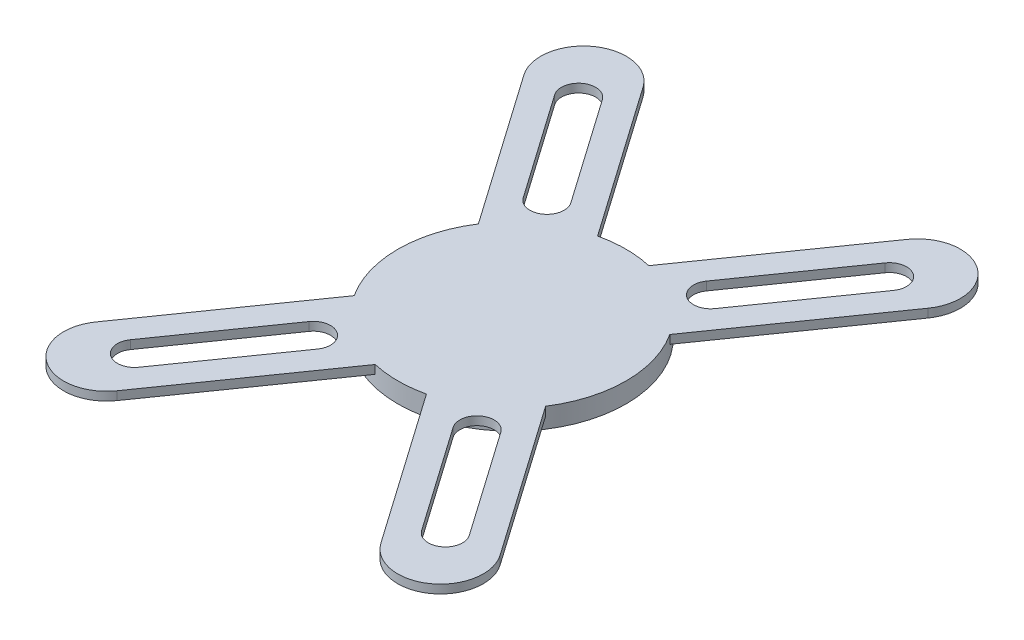
ISO-10303-21;
HEADER;
FILE_DESCRIPTION(('STEP AP214'),'2;1');
FILE_NAME('part.step','',(''),(''),'','','');
FILE_SCHEMA(('AUTOMOTIVE_DESIGN { 1 0 10303 214 1 1 1 1 }'));
ENDSEC;
DATA;
#1=APPLICATION_CONTEXT('core data for automotive mechanical design processes');
#2=APPLICATION_PROTOCOL_DEFINITION('international standard','automotive_design',2000,#1);
#3=PRODUCT_CONTEXT('',#1,'mechanical');
#4=PRODUCT('Part','Part','',(#3));
#5=PRODUCT_RELATED_PRODUCT_CATEGORY('part','',(#4));
#6=PRODUCT_DEFINITION_FORMATION('','',#4);
#7=PRODUCT_DEFINITION_CONTEXT('part definition',#1,'design');
#8=PRODUCT_DEFINITION('design','',#6,#7);
#9=PRODUCT_DEFINITION_SHAPE('','',#8);
#10=(LENGTH_UNIT() NAMED_UNIT(*) SI_UNIT(.MILLI.,.METRE.));
#11=(NAMED_UNIT(*) PLANE_ANGLE_UNIT() SI_UNIT($,.RADIAN.));
#12=(NAMED_UNIT(*) SI_UNIT($,.STERADIAN.) SOLID_ANGLE_UNIT());
#13=UNCERTAINTY_MEASURE_WITH_UNIT(LENGTH_MEASURE(1.E-05),#10,'distance_accuracy_value','');
#14=(GEOMETRIC_REPRESENTATION_CONTEXT(3) GLOBAL_UNCERTAINTY_ASSIGNED_CONTEXT((#13)) GLOBAL_UNIT_ASSIGNED_CONTEXT((#10,
#11,#12)) REPRESENTATION_CONTEXT('',''));
#15=CARTESIAN_POINT('',(0.,0.,0.));
#16=DIRECTION('',(0.,0.,1.));
#17=DIRECTION('',(1.,0.,0.));
#18=AXIS2_PLACEMENT_3D('',#15,#16,#17);
#19=CARTESIAN_POINT('',(0.,4.,0.));
#20=DIRECTION('',(0.,-1.,0.));
#21=DIRECTION('',(0.,0.,-1.));
#22=AXIS2_PLACEMENT_3D('',#19,#20,#21);
#23=CYLINDRICAL_SURFACE('',#22,40.);
#24=CARTESIAN_POINT('',(0.,4.,0.));
#25=DIRECTION('',(0.,1.,0.));
#26=DIRECTION('',(0.,0.,1.));
#27=AXIS2_PLACEMENT_3D('',#24,#25,#26);
#28=CIRCLE('',#27,40.);
#29=CARTESIAN_POINT('',(8.98150283316708,4.,38.9786173030523));
#30=VERTEX_POINT('',#29);
#31=CARTESIAN_POINT('',(33.5560641618367,4.,21.7713242125209));
#32=VERTEX_POINT('',#31);
#33=EDGE_CURVE('E11',#30,#32,#28,.T.);
#34=ORIENTED_EDGE('',*,*,#33,.F.);
#35=DIRECTION('',(0.,-1.,0.));
#36=VECTOR('',#35,1.);
#37=CARTESIAN_POINT('',(8.98150283316708,7.,38.9786173030523));
#38=LINE('',#37,#36);
#39=CARTESIAN_POINT('',(8.98150283316708,7.,38.9786173030523));
#40=VERTEX_POINT('',#39);
#41=EDGE_CURVE('E442',#40,#30,#38,.T.);
#42=ORIENTED_EDGE('',*,*,#41,.F.);
#43=CARTESIAN_POINT('',(0.,7.,0.));
#44=DIRECTION('',(0.,1.,0.));
#45=DIRECTION('',(0.,0.,1.));
#46=AXIS2_PLACEMENT_3D('',#43,#44,#45);
#47=CIRCLE('',#46,40.);
#48=CARTESIAN_POINT('',(-8.9815028331671,7.,38.9786173030523));
#49=VERTEX_POINT('',#48);
#50=EDGE_CURVE('E408',#49,#40,#47,.T.);
#51=ORIENTED_EDGE('',*,*,#50,.F.);
#52=DIRECTION('',(0.,-1.,0.));
#53=VECTOR('',#52,1.);
#54=CARTESIAN_POINT('',(-8.9815028331671,7.,38.9786173030523));
#55=LINE('',#54,#53);
#56=CARTESIAN_POINT('',(-8.98150283316708,4.,38.9786173030523));
#57=VERTEX_POINT('',#56);
#58=EDGE_CURVE('E445',#49,#57,#55,.T.);
#59=ORIENTED_EDGE('',*,*,#58,.T.);
#60=CARTESIAN_POINT('',(-33.5560641618367,4.,21.7713242125209));
#61=VERTEX_POINT('',#60);
#62=EDGE_CURVE('E46',#61,#57,#28,.T.);
#63=ORIENTED_EDGE('',*,*,#62,.F.);
#64=DIRECTION('',(0.,-1.,0.));
#65=VECTOR('',#64,1.);
#66=CARTESIAN_POINT('',(-33.5560641618367,7.,21.7713242125209));
#67=LINE('',#66,#65);
#68=CARTESIAN_POINT('',(-33.5560641618367,7.,21.7713242125209));
#69=VERTEX_POINT('',#68);
#70=EDGE_CURVE('E454',#69,#61,#67,.T.);
#71=ORIENTED_EDGE('',*,*,#70,.F.);
#72=CARTESIAN_POINT('',(0.,7.,0.));
#73=DIRECTION('',(0.,1.,0.));
#74=DIRECTION('',(0.,0.,1.));
#75=AXIS2_PLACEMENT_3D('',#72,#73,#74);
#76=CIRCLE('',#75,40.);
#77=CARTESIAN_POINT('',(-33.5560641618367,7.,-21.7713242125209));
#78=VERTEX_POINT('',#77);
#79=EDGE_CURVE('E400',#78,#69,#76,.T.);
#80=ORIENTED_EDGE('',*,*,#79,.F.);
#81=DIRECTION('',(0.,-1.,0.));
#82=VECTOR('',#81,1.);
#83=CARTESIAN_POINT('',(-33.5560641618367,7.,-21.7713242125209));
#84=LINE('',#83,#82);
#85=CARTESIAN_POINT('',(-33.5560641618367,4.,-21.7713242125209));
#86=VERTEX_POINT('',#85);
#87=EDGE_CURVE('E457',#78,#86,#84,.T.);
#88=ORIENTED_EDGE('',*,*,#87,.T.);
#89=CARTESIAN_POINT('',(-8.98150283316708,4.,-38.9786173030523));
#90=VERTEX_POINT('',#89);
#91=EDGE_CURVE('E491',#90,#86,#28,.T.);
#92=ORIENTED_EDGE('',*,*,#91,.F.);
#93=DIRECTION('',(0.,-1.,0.));
#94=VECTOR('',#93,1.);
#95=CARTESIAN_POINT('',(-8.98150283316708,7.,-38.9786173030523));
#96=LINE('',#95,#94);
#97=CARTESIAN_POINT('',(-8.98150283316708,7.,-38.9786173030523));
#98=VERTEX_POINT('',#97);
#99=EDGE_CURVE('E466',#98,#90,#96,.T.);
#100=ORIENTED_EDGE('',*,*,#99,.F.);
#101=CARTESIAN_POINT('',(0.,7.,0.));
#102=DIRECTION('',(0.,1.,0.));
#103=DIRECTION('',(0.,0.,1.));
#104=AXIS2_PLACEMENT_3D('',#101,#102,#103);
#105=CIRCLE('',#104,40.);
#106=CARTESIAN_POINT('',(8.98150283316708,7.,-38.9786173030523));
#107=VERTEX_POINT('',#106);
#108=EDGE_CURVE('E392',#107,#98,#105,.T.);
#109=ORIENTED_EDGE('',*,*,#108,.F.);
#110=DIRECTION('',(0.,-1.,0.));
#111=VECTOR('',#110,1.);
#112=CARTESIAN_POINT('',(8.98150283316708,7.,-38.9786173030523));
#113=LINE('',#112,#111);
#114=CARTESIAN_POINT('',(8.98150283316708,4.,-38.9786173030523));
#115=VERTEX_POINT('',#114);
#116=EDGE_CURVE('E469',#107,#115,#113,.T.);
#117=ORIENTED_EDGE('',*,*,#116,.T.);
#118=CARTESIAN_POINT('',(33.5560641618367,4.,-21.7713242125209));
#119=VERTEX_POINT('',#118);
#120=EDGE_CURVE('E45',#119,#115,#28,.T.);
#121=ORIENTED_EDGE('',*,*,#120,.F.);
#122=DIRECTION('',(0.,-1.,0.));
#123=VECTOR('',#122,1.);
#124=CARTESIAN_POINT('',(33.5560641618367,7.,-21.7713242125209));
#125=LINE('',#124,#123);
#126=CARTESIAN_POINT('',(33.5560641618367,7.,-21.7713242125209));
#127=VERTEX_POINT('',#126);
#128=EDGE_CURVE('E478',#127,#119,#125,.T.);
#129=ORIENTED_EDGE('',*,*,#128,.F.);
#130=CARTESIAN_POINT('',(0.,7.,0.));
#131=DIRECTION('',(0.,1.,0.));
#132=DIRECTION('',(0.,0.,1.));
#133=AXIS2_PLACEMENT_3D('',#130,#131,#132);
#134=CIRCLE('',#133,40.);
#135=CARTESIAN_POINT('',(33.5560641618367,7.,21.7713242125209));
#136=VERTEX_POINT('',#135);
#137=EDGE_CURVE('E384',#136,#127,#134,.T.);
#138=ORIENTED_EDGE('',*,*,#137,.F.);
#139=DIRECTION('',(0.,-1.,0.));
#140=VECTOR('',#139,1.);
#141=CARTESIAN_POINT('',(33.5560641618367,7.,21.7713242125209));
#142=LINE('',#141,#140);
#143=EDGE_CURVE('E481',#136,#32,#142,.T.);
#144=ORIENTED_EDGE('',*,*,#143,.T.);
#145=EDGE_LOOP('',(#34,#42,#51,#59,#63,#71,#80,#88,#92,#100,#109,#117,#121,#129,#138,#144));
#146=FACE_BOUND('',#145,.T.);
#147=CARTESIAN_POINT('',(0.,0.,0.));
#148=DIRECTION('',(0.,1.,0.));
#149=DIRECTION('',(0.,0.,1.));
#150=AXIS2_PLACEMENT_3D('',#147,#148,#149);
#151=CIRCLE('',#150,40.);
#152=CARTESIAN_POINT('',(0.,0.,40.));
#153=VERTEX_POINT('',#152);
#154=EDGE_CURVE('E40',#153,#153,#151,.T.);
#155=ORIENTED_EDGE('',*,*,#154,.T.);
#156=EDGE_LOOP('',(#155));
#157=FACE_BOUND('',#156,.T.);
#158=ADVANCED_FACE('F37',(#146,#157),#23,.T.);
#159=CARTESIAN_POINT('',(0.,0.,0.));
#160=DIRECTION('',(0.,1.,0.));
#161=DIRECTION('',(0.,0.,1.));
#162=AXIS2_PLACEMENT_3D('',#159,#160,#161);
#163=PLANE('',#162);
#164=ORIENTED_EDGE('',*,*,#154,.F.);
#165=EDGE_LOOP('',(#164));
#166=FACE_BOUND('',#165,.T.);
#167=ADVANCED_FACE('F572',(#166),#163,.F.);
#168=CARTESIAN_POINT('',(58.5512518603201,4.,83.619853636571));
#169=DIRECTION('',(0.,-1.,0.));
#170=DIRECTION('',(0.,0.,-1.));
#171=AXIS2_PLACEMENT_3D('',#168,#169,#170);
#172=PLANE('',#171);
#173=CARTESIAN_POINT('',(28.6788218175525,4.,40.9576022144495));
#174=DIRECTION('',(0.,-1.,0.));
#175=DIRECTION('',(0.,0.,-1.));
#176=AXIS2_PLACEMENT_3D('',#173,#174,#175);
#177=CIRCLE('',#176,6.00000000000002);
#178=CARTESIAN_POINT('',(23.7639095518185,4.,44.3990608325558));
#179=VERTEX_POINT('',#178);
#180=CARTESIAN_POINT('',(33.5937340832865,4.,37.5161435963432));
#181=VERTEX_POINT('',#180);
#182=EDGE_CURVE('E53',#179,#181,#177,.T.);
#183=ORIENTED_EDGE('',*,*,#182,.F.);
#184=DIRECTION('',(-0.573576436351049,0.,-0.819152044288989));
#185=VECTOR('',#184,1.);
#186=CARTESIAN_POINT('',(23.7639095518185,4.,44.3990608325558));
#187=LINE('',#186,#185);
#188=CARTESIAN_POINT('',(49.5748491876158,4.,81.2609028255603));
#189=VERTEX_POINT('',#188);
#190=EDGE_CURVE('E326',#189,#179,#187,.T.);
#191=ORIENTED_EDGE('',*,*,#190,.F.);
#192=CARTESIAN_POINT('',(54.4897614533497,4.,77.819444207454));
#193=DIRECTION('',(0.,-1.,0.));
#194=DIRECTION('',(0.,0.,-1.));
#195=AXIS2_PLACEMENT_3D('',#192,#193,#194);
#196=CIRCLE('',#195,6.00000000000002);
#197=CARTESIAN_POINT('',(59.4046737190837,4.,74.3779855893477));
#198=VERTEX_POINT('',#197);
#199=EDGE_CURVE('E329',#198,#189,#196,.T.);
#200=ORIENTED_EDGE('',*,*,#199,.F.);
#201=DIRECTION('',(0.573576436351049,0.,0.819152044288989));
#202=VECTOR('',#201,1.);
#203=CARTESIAN_POINT('',(59.4046737190837,4.,74.3779855893477));
#204=LINE('',#203,#202);
#205=EDGE_CURVE('E333',#181,#198,#204,.T.);
#206=ORIENTED_EDGE('',*,*,#205,.F.);
#207=EDGE_LOOP('',(#183,#191,#200,#206));
#208=FACE_BOUND('',#207,.T.);
#209=DIRECTION('',(0.57357643635105,0.,0.819152044288989));
#210=VECTOR('',#209,1.);
#211=CARTESIAN_POINT('',(46.2639711959853,4.,92.2235001818367));
#212=LINE('',#211,#210);
#213=CARTESIAN_POINT('',(46.2639711959853,4.,92.2235001818367));
#214=VERTEX_POINT('',#213);
#215=EDGE_CURVE('E382',#30,#214,#212,.T.);
#216=ORIENTED_EDGE('',*,*,#215,.F.);
#217=ORIENTED_EDGE('',*,*,#33,.T.);
#218=DIRECTION('',(-0.573576436351049,0.,-0.81915204428899));
#219=VECTOR('',#218,1.);
#220=CARTESIAN_POINT('',(70.8385325246549,4.,75.0162070913053));
#221=LINE('',#220,#219);
#222=CARTESIAN_POINT('',(70.8385325246549,4.,75.0162070913053));
#223=VERTEX_POINT('',#222);
#224=EDGE_CURVE('E415',#223,#32,#221,.T.);
#225=ORIENTED_EDGE('',*,*,#224,.F.);
#226=CARTESIAN_POINT('',(58.5512518603201,4.,83.619853636571));
#227=DIRECTION('',(0.,1.,0.));
#228=DIRECTION('',(0.,0.,-1.));
#229=AXIS2_PLACEMENT_3D('',#226,#227,#228);
#230=CIRCLE('',#229,14.9999999999999);
#231=EDGE_CURVE('E372',#214,#223,#230,.T.);
#232=ORIENTED_EDGE('',*,*,#231,.F.);
#233=EDGE_LOOP('',(#216,#217,#225,#232));
#234=FACE_BOUND('',#233,.T.);
#235=ADVANCED_FACE('F529',(#208,#234),#172,.T.);
#236=CARTESIAN_POINT('',(28.6788218175525,4.,-40.9576022144494));
#237=DIRECTION('',(0.,-1.,0.));
#238=DIRECTION('',(0.,0.,-1.));
#239=AXIS2_PLACEMENT_3D('',#236,#237,#238);
#240=CIRCLE('',#239,6.);
#241=CARTESIAN_POINT('',(33.5937340832864,4.,-37.5161435963431));
#242=VERTEX_POINT('',#241);
#243=CARTESIAN_POINT('',(23.7639095518186,4.,-44.3990608325558));
#244=VERTEX_POINT('',#243);
#245=EDGE_CURVE('E61',#242,#244,#240,.T.);
#246=ORIENTED_EDGE('',*,*,#245,.F.);
#247=DIRECTION('',(-0.57357643635105,0.,0.819152044288989));
#248=VECTOR('',#247,1.);
#249=CARTESIAN_POINT('',(33.5937340832864,4.,-37.5161435963431));
#250=LINE('',#249,#248);
#251=CARTESIAN_POINT('',(59.4046737190837,4.,-74.3779855893476));
#252=VERTEX_POINT('',#251);
#253=EDGE_CURVE('E351',#252,#242,#250,.T.);
#254=ORIENTED_EDGE('',*,*,#253,.F.);
#255=CARTESIAN_POINT('',(54.4897614533498,4.,-77.8194442074539));
#256=DIRECTION('',(0.,-1.,0.));
#257=DIRECTION('',(0.,0.,-1.));
#258=AXIS2_PLACEMENT_3D('',#255,#256,#257);
#259=CIRCLE('',#258,6.);
#260=CARTESIAN_POINT('',(49.5748491876158,4.,-81.2609028255602));
#261=VERTEX_POINT('',#260);
#262=EDGE_CURVE('E365',#261,#252,#259,.T.);
#263=ORIENTED_EDGE('',*,*,#262,.F.);
#264=DIRECTION('',(0.57357643635105,0.,-0.819152044288989));
#265=VECTOR('',#264,1.);
#266=CARTESIAN_POINT('',(49.5748491876158,4.,-81.2609028255602));
#267=LINE('',#266,#265);
#268=EDGE_CURVE('E362',#244,#261,#267,.T.);
#269=ORIENTED_EDGE('',*,*,#268,.F.);
#270=EDGE_LOOP('',(#246,#254,#263,#269));
#271=FACE_BOUND('',#270,.T.);
#272=DIRECTION('',(0.573576436351049,0.,-0.81915204428899));
#273=VECTOR('',#272,1.);
#274=CARTESIAN_POINT('',(70.8385325246549,4.,-75.0162070913053));
#275=LINE('',#274,#273);
#276=CARTESIAN_POINT('',(70.8385325246549,4.,-75.0162070913053));
#277=VERTEX_POINT('',#276);
#278=EDGE_CURVE('E418',#119,#277,#275,.T.);
#279=ORIENTED_EDGE('',*,*,#278,.F.);
#280=ORIENTED_EDGE('',*,*,#120,.T.);
#281=DIRECTION('',(-0.57357643635105,0.,0.819152044288989));
#282=VECTOR('',#281,1.);
#283=CARTESIAN_POINT('',(46.2639711959853,4.,-92.2235001818367));
#284=LINE('',#283,#282);
#285=CARTESIAN_POINT('',(46.2639711959853,4.,-92.2235001818367));
#286=VERTEX_POINT('',#285);
#287=EDGE_CURVE('E422',#286,#115,#284,.T.);
#288=ORIENTED_EDGE('',*,*,#287,.F.);
#289=CARTESIAN_POINT('',(58.5512518603201,4.,-83.619853636571));
#290=DIRECTION('',(0.,1.,0.));
#291=DIRECTION('',(0.,0.,1.));
#292=AXIS2_PLACEMENT_3D('',#289,#290,#291);
#293=CIRCLE('',#292,14.9999999999999);
#294=EDGE_CURVE('E420',#277,#286,#293,.T.);
#295=ORIENTED_EDGE('',*,*,#294,.F.);
#296=EDGE_LOOP('',(#279,#280,#288,#295));
#297=FACE_BOUND('',#296,.T.);
#298=ADVANCED_FACE('F500',(#271,#297),#172,.T.);
#299=CARTESIAN_POINT('',(-28.6788218175525,4.,-40.9576022144495));
#300=DIRECTION('',(0.,-1.,0.));
#301=DIRECTION('',(0.,0.,1.));
#302=AXIS2_PLACEMENT_3D('',#299,#300,#301);
#303=CIRCLE('',#302,5.99999999999998);
#304=CARTESIAN_POINT('',(-23.7639095518185,4.,-44.3990608325557));
#305=VERTEX_POINT('',#304);
#306=CARTESIAN_POINT('',(-33.5937340832864,4.,-37.5161435963432));
#307=VERTEX_POINT('',#306);
#308=EDGE_CURVE('E308',#305,#307,#303,.T.);
#309=ORIENTED_EDGE('',*,*,#308,.F.);
#310=DIRECTION('',(0.573576436351049,0.,0.81915204428899));
#311=VECTOR('',#310,1.);
#312=CARTESIAN_POINT('',(-49.5748491876158,4.,-81.2609028255603));
#313=LINE('',#312,#311);
#314=CARTESIAN_POINT('',(-49.5748491876158,4.,-81.2609028255603));
#315=VERTEX_POINT('',#314);
#316=EDGE_CURVE('E298',#315,#305,#313,.T.);
#317=ORIENTED_EDGE('',*,*,#316,.F.);
#318=CARTESIAN_POINT('',(-54.4897614533497,4.,-77.819444207454));
#319=DIRECTION('',(0.,-1.,0.));
#320=DIRECTION('',(0.,0.,-1.));
#321=AXIS2_PLACEMENT_3D('',#318,#319,#320);
#322=CIRCLE('',#321,5.99999999999999);
#323=CARTESIAN_POINT('',(-59.4046737190836,4.,-74.3779855893477));
#324=VERTEX_POINT('',#323);
#325=EDGE_CURVE('E301',#324,#315,#322,.T.);
#326=ORIENTED_EDGE('',*,*,#325,.F.);
#327=DIRECTION('',(-0.573576436351049,0.,-0.81915204428899));
#328=VECTOR('',#327,1.);
#329=CARTESIAN_POINT('',(-33.5937340832864,4.,-37.5161435963432));
#330=LINE('',#329,#328);
#331=EDGE_CURVE('E305',#307,#324,#330,.T.);
#332=ORIENTED_EDGE('',*,*,#331,.F.);
#333=EDGE_LOOP('',(#309,#317,#326,#332));
#334=FACE_BOUND('',#333,.T.);
#335=DIRECTION('',(-0.57357643635105,0.,-0.819152044288989));
#336=VECTOR('',#335,1.);
#337=CARTESIAN_POINT('',(-46.2639711959853,4.,-92.2235001818367));
#338=LINE('',#337,#336);
#339=CARTESIAN_POINT('',(-46.2639711959853,4.,-92.2235001818367));
#340=VERTEX_POINT('',#339);
#341=EDGE_CURVE('E425',#90,#340,#338,.T.);
#342=ORIENTED_EDGE('',*,*,#341,.F.);
#343=ORIENTED_EDGE('',*,*,#91,.T.);
#344=DIRECTION('',(0.573576436351049,0.,0.81915204428899));
#345=VECTOR('',#344,1.);
#346=CARTESIAN_POINT('',(-70.8385325246549,4.,-75.0162070913053));
#347=LINE('',#346,#345);
#348=CARTESIAN_POINT('',(-70.8385325246549,4.,-75.0162070913053));
#349=VERTEX_POINT('',#348);
#350=EDGE_CURVE('E429',#349,#86,#347,.T.);
#351=ORIENTED_EDGE('',*,*,#350,.F.);
#352=CARTESIAN_POINT('',(-58.5512518603201,4.,-83.619853636571));
#353=DIRECTION('',(0.,1.,0.));
#354=DIRECTION('',(0.,0.,1.));
#355=AXIS2_PLACEMENT_3D('',#352,#353,#354);
#356=CIRCLE('',#355,14.9999999999999);
#357=EDGE_CURVE('E427',#340,#349,#356,.T.);
#358=ORIENTED_EDGE('',*,*,#357,.F.);
#359=EDGE_LOOP('',(#342,#343,#351,#358));
#360=FACE_BOUND('',#359,.T.);
#361=ADVANCED_FACE('F558',(#334,#360),#172,.T.);
#362=CARTESIAN_POINT('',(58.5512518603201,7.,83.619853636571));
#363=DIRECTION('',(0.,-1.,0.));
#364=DIRECTION('',(0.,0.,-1.));
#365=AXIS2_PLACEMENT_3D('',#362,#363,#364);
#366=CYLINDRICAL_SURFACE('',#365,14.9999999999999);
#367=ORIENTED_EDGE('',*,*,#231,.T.);
#368=DIRECTION('',(0.,-1.,0.));
#369=VECTOR('',#368,1.);
#370=CARTESIAN_POINT('',(70.8385325246549,7.,75.0162070913053));
#371=LINE('',#370,#369);
#372=CARTESIAN_POINT('',(70.8385325246549,7.,75.0162070913053));
#373=VERTEX_POINT('',#372);
#374=EDGE_CURVE('E484',#373,#223,#371,.T.);
#375=ORIENTED_EDGE('',*,*,#374,.F.);
#376=CARTESIAN_POINT('',(58.5512518603201,7.,83.619853636571));
#377=DIRECTION('',(0.,1.,0.));
#378=DIRECTION('',(0.,0.,-1.));
#379=AXIS2_PLACEMENT_3D('',#376,#377,#378);
#380=CIRCLE('',#379,14.9999999999999);
#381=CARTESIAN_POINT('',(46.2639711959853,7.,92.2235001818367));
#382=VERTEX_POINT('',#381);
#383=EDGE_CURVE('E378',#382,#373,#380,.T.);
#384=ORIENTED_EDGE('',*,*,#383,.F.);
#385=DIRECTION('',(0.,-1.,0.));
#386=VECTOR('',#385,1.);
#387=CARTESIAN_POINT('',(46.2639711959853,7.,92.2235001818367));
#388=LINE('',#387,#386);
#389=EDGE_CURVE('E412',#382,#214,#388,.T.);
#390=ORIENTED_EDGE('',*,*,#389,.T.);
#391=EDGE_LOOP('',(#367,#375,#384,#390));
#392=FACE_BOUND('',#391,.T.);
#393=ADVANCED_FACE('F583',(#392),#366,.T.);
#394=CARTESIAN_POINT('',(70.8385325246549,7.,75.0162070913053));
#395=DIRECTION('',(-0.81915204428899,0.,0.573576436351049));
#396=DIRECTION('',(0.573576436351049,0.,0.81915204428899));
#397=AXIS2_PLACEMENT_3D('',#394,#395,#396);
#398=PLANE('',#397);
#399=ORIENTED_EDGE('',*,*,#224,.T.);
#400=ORIENTED_EDGE('',*,*,#143,.F.);
#401=DIRECTION('',(-0.573576436351049,0.,-0.81915204428899));
#402=VECTOR('',#401,1.);
#403=CARTESIAN_POINT('',(70.8385325246549,7.,75.0162070913053));
#404=LINE('',#403,#402);
#405=EDGE_CURVE('E381',#373,#136,#404,.T.);
#406=ORIENTED_EDGE('',*,*,#405,.F.);
#407=ORIENTED_EDGE('',*,*,#374,.T.);
#408=EDGE_LOOP('',(#399,#400,#406,#407));
#409=FACE_BOUND('',#408,.T.);
#410=ADVANCED_FACE('F525',(#409),#398,.F.);
#411=CARTESIAN_POINT('',(70.8385325246549,7.,-75.0162070913053));
#412=DIRECTION('',(-0.81915204428899,0.,-0.573576436351049));
#413=DIRECTION('',(-0.573576436351049,0.,0.81915204428899));
#414=AXIS2_PLACEMENT_3D('',#411,#412,#413);
#415=PLANE('',#414);
#416=ORIENTED_EDGE('',*,*,#278,.T.);
#417=DIRECTION('',(0.,-1.,0.));
#418=VECTOR('',#417,1.);
#419=CARTESIAN_POINT('',(70.8385325246549,7.,-75.0162070913053));
#420=LINE('',#419,#418);
#421=CARTESIAN_POINT('',(70.8385325246549,7.,-75.0162070913053));
#422=VERTEX_POINT('',#421);
#423=EDGE_CURVE('E475',#422,#277,#420,.T.);
#424=ORIENTED_EDGE('',*,*,#423,.F.);
#425=DIRECTION('',(0.573576436351049,0.,-0.81915204428899));
#426=VECTOR('',#425,1.);
#427=CARTESIAN_POINT('',(70.8385325246549,7.,-75.0162070913053));
#428=LINE('',#427,#426);
#429=EDGE_CURVE('E386',#127,#422,#428,.T.);
#430=ORIENTED_EDGE('',*,*,#429,.F.);
#431=ORIENTED_EDGE('',*,*,#128,.T.);
#432=EDGE_LOOP('',(#416,#424,#430,#431));
#433=FACE_BOUND('',#432,.T.);
#434=ADVANCED_FACE('F521',(#433),#415,.F.);
#435=CARTESIAN_POINT('',(58.5512518603201,7.,-83.619853636571));
#436=DIRECTION('',(0.,-1.,0.));
#437=DIRECTION('',(0.,0.,-1.));
#438=AXIS2_PLACEMENT_3D('',#435,#436,#437);
#439=CYLINDRICAL_SURFACE('',#438,14.9999999999999);
#440=ORIENTED_EDGE('',*,*,#294,.T.);
#441=DIRECTION('',(0.,-1.,0.));
#442=VECTOR('',#441,1.);
#443=CARTESIAN_POINT('',(46.2639711959853,7.,-92.2235001818367));
#444=LINE('',#443,#442);
#445=CARTESIAN_POINT('',(46.2639711959853,7.,-92.2235001818367));
#446=VERTEX_POINT('',#445);
#447=EDGE_CURVE('E472',#446,#286,#444,.T.);
#448=ORIENTED_EDGE('',*,*,#447,.F.);
#449=CARTESIAN_POINT('',(58.5512518603201,7.,-83.619853636571));
#450=DIRECTION('',(0.,1.,0.));
#451=DIRECTION('',(0.,0.,1.));
#452=AXIS2_PLACEMENT_3D('',#449,#450,#451);
#453=CIRCLE('',#452,14.9999999999999);
#454=EDGE_CURVE('E388',#422,#446,#453,.T.);
#455=ORIENTED_EDGE('',*,*,#454,.F.);
#456=ORIENTED_EDGE('',*,*,#423,.T.);
#457=EDGE_LOOP('',(#440,#448,#455,#456));
#458=FACE_BOUND('',#457,.T.);
#459=ADVANCED_FACE('F519',(#458),#439,.T.);
#460=CARTESIAN_POINT('',(46.2639711959853,7.,-92.2235001818367));
#461=DIRECTION('',(0.819152044288989,0.,0.57357643635105));
#462=DIRECTION('',(0.57357643635105,0.,-0.819152044288989));
#463=AXIS2_PLACEMENT_3D('',#460,#461,#462);
#464=PLANE('',#463);
#465=ORIENTED_EDGE('',*,*,#287,.T.);
#466=ORIENTED_EDGE('',*,*,#116,.F.);
#467=DIRECTION('',(-0.57357643635105,0.,0.819152044288989));
#468=VECTOR('',#467,1.);
#469=CARTESIAN_POINT('',(46.2639711959853,7.,-92.2235001818367));
#470=LINE('',#469,#468);
#471=EDGE_CURVE('E390',#446,#107,#470,.T.);
#472=ORIENTED_EDGE('',*,*,#471,.F.);
#473=ORIENTED_EDGE('',*,*,#447,.T.);
#474=EDGE_LOOP('',(#465,#466,#472,#473));
#475=FACE_BOUND('',#474,.T.);
#476=ADVANCED_FACE('F506',(#475),#464,.F.);
#477=CARTESIAN_POINT('',(-46.2639711959853,7.,-92.2235001818367));
#478=DIRECTION('',(-0.819152044288989,0.,0.57357643635105));
#479=DIRECTION('',(0.57357643635105,0.,0.819152044288989));
#480=AXIS2_PLACEMENT_3D('',#477,#478,#479);
#481=PLANE('',#480);
#482=ORIENTED_EDGE('',*,*,#341,.T.);
#483=DIRECTION('',(0.,-1.,0.));
#484=VECTOR('',#483,1.);
#485=CARTESIAN_POINT('',(-46.2639711959853,7.,-92.2235001818367));
#486=LINE('',#485,#484);
#487=CARTESIAN_POINT('',(-46.2639711959853,7.,-92.2235001818367));
#488=VERTEX_POINT('',#487);
#489=EDGE_CURVE('E463',#488,#340,#486,.T.);
#490=ORIENTED_EDGE('',*,*,#489,.F.);
#491=DIRECTION('',(-0.57357643635105,0.,-0.819152044288989));
#492=VECTOR('',#491,1.);
#493=CARTESIAN_POINT('',(-46.2639711959853,7.,-92.2235001818367));
#494=LINE('',#493,#492);
#495=EDGE_CURVE('E394',#98,#488,#494,.T.);
#496=ORIENTED_EDGE('',*,*,#495,.F.);
#497=ORIENTED_EDGE('',*,*,#99,.T.);
#498=EDGE_LOOP('',(#482,#490,#496,#497));
#499=FACE_BOUND('',#498,.T.);
#500=ADVANCED_FACE('F562',(#499),#481,.F.);
#501=CARTESIAN_POINT('',(-58.5512518603201,7.,-83.619853636571));
#502=DIRECTION('',(0.,-1.,0.));
#503=DIRECTION('',(0.,0.,-1.));
#504=AXIS2_PLACEMENT_3D('',#501,#502,#503);
#505=CYLINDRICAL_SURFACE('',#504,14.9999999999999);
#506=ORIENTED_EDGE('',*,*,#357,.T.);
#507=DIRECTION('',(0.,-1.,0.));
#508=VECTOR('',#507,1.);
#509=CARTESIAN_POINT('',(-70.8385325246549,7.,-75.0162070913053));
#510=LINE('',#509,#508);
#511=CARTESIAN_POINT('',(-70.8385325246549,7.,-75.0162070913053));
#512=VERTEX_POINT('',#511);
#513=EDGE_CURVE('E460',#512,#349,#510,.T.);
#514=ORIENTED_EDGE('',*,*,#513,.F.);
#515=CARTESIAN_POINT('',(-58.5512518603201,7.,-83.619853636571));
#516=DIRECTION('',(0.,1.,0.));
#517=DIRECTION('',(0.,0.,1.));
#518=AXIS2_PLACEMENT_3D('',#515,#516,#517);
#519=CIRCLE('',#518,14.9999999999999);
#520=EDGE_CURVE('E396',#488,#512,#519,.T.);
#521=ORIENTED_EDGE('',*,*,#520,.F.);
#522=ORIENTED_EDGE('',*,*,#489,.T.);
#523=EDGE_LOOP('',(#506,#514,#521,#522));
#524=FACE_BOUND('',#523,.T.);
#525=ADVANCED_FACE('F560',(#524),#505,.T.);
#526=CARTESIAN_POINT('',(-70.8385325246549,7.,-75.0162070913053));
#527=DIRECTION('',(0.81915204428899,0.,-0.573576436351049));
#528=DIRECTION('',(-0.573576436351049,0.,-0.81915204428899));
#529=AXIS2_PLACEMENT_3D('',#526,#527,#528);
#530=PLANE('',#529);
#531=ORIENTED_EDGE('',*,*,#350,.T.);
#532=ORIENTED_EDGE('',*,*,#87,.F.);
#533=DIRECTION('',(0.573576436351049,0.,0.81915204428899));
#534=VECTOR('',#533,1.);
#535=CARTESIAN_POINT('',(-70.8385325246549,7.,-75.0162070913053));
#536=LINE('',#535,#534);
#537=EDGE_CURVE('E398',#512,#78,#536,.T.);
#538=ORIENTED_EDGE('',*,*,#537,.F.);
#539=ORIENTED_EDGE('',*,*,#513,.T.);
#540=EDGE_LOOP('',(#531,#532,#538,#539));
#541=FACE_BOUND('',#540,.T.);
#542=ADVANCED_FACE('F556',(#541),#530,.F.);
#543=CARTESIAN_POINT('',(-70.8385325246549,7.,75.0162070913053));
#544=DIRECTION('',(0.81915204428899,0.,0.573576436351049));
#545=DIRECTION('',(0.573576436351049,0.,-0.81915204428899));
#546=AXIS2_PLACEMENT_3D('',#543,#544,#545);
#547=PLANE('',#546);
#548=DIRECTION('',(-0.573576436351049,0.,0.81915204428899));
#549=VECTOR('',#548,1.);
#550=CARTESIAN_POINT('',(-70.8385325246549,4.,75.0162070913053));
#551=LINE('',#550,#549);
#552=CARTESIAN_POINT('',(-70.8385325246549,4.,75.0162070913053));
#553=VERTEX_POINT('',#552);
#554=EDGE_CURVE('E432',#61,#553,#551,.T.);
#555=ORIENTED_EDGE('',*,*,#554,.T.);
#556=DIRECTION('',(0.,-1.,0.));
#557=VECTOR('',#556,1.);
#558=CARTESIAN_POINT('',(-70.8385325246549,7.,75.0162070913053));
#559=LINE('',#558,#557);
#560=CARTESIAN_POINT('',(-70.8385325246549,7.,75.0162070913053));
#561=VERTEX_POINT('',#560);
#562=EDGE_CURVE('E451',#561,#553,#559,.T.);
#563=ORIENTED_EDGE('',*,*,#562,.F.);
#564=DIRECTION('',(-0.573576436351049,0.,0.81915204428899));
#565=VECTOR('',#564,1.);
#566=CARTESIAN_POINT('',(-70.8385325246549,7.,75.0162070913053));
#567=LINE('',#566,#565);
#568=EDGE_CURVE('E402',#69,#561,#567,.T.);
#569=ORIENTED_EDGE('',*,*,#568,.F.);
#570=ORIENTED_EDGE('',*,*,#70,.T.);
#571=EDGE_LOOP('',(#555,#563,#569,#570));
#572=FACE_BOUND('',#571,.T.);
#573=ADVANCED_FACE('F549',(#572),#547,.F.);
#574=CARTESIAN_POINT('',(-58.5512518603201,7.,83.6198536365709));
#575=DIRECTION('',(0.,-1.,0.));
#576=DIRECTION('',(0.,0.,-1.));
#577=AXIS2_PLACEMENT_3D('',#574,#575,#576);
#578=CYLINDRICAL_SURFACE('',#577,14.9999999999999);
#579=CARTESIAN_POINT('',(-58.5512518603201,4.,83.6198536365709));
#580=DIRECTION('',(0.,1.,0.));
#581=DIRECTION('',(0.,0.,1.));
#582=AXIS2_PLACEMENT_3D('',#579,#580,#581);
#583=CIRCLE('',#582,14.9999999999999);
#584=CARTESIAN_POINT('',(-46.2639711959853,4.,92.2235001818367));
#585=VERTEX_POINT('',#584);
#586=EDGE_CURVE('E434',#553,#585,#583,.T.);
#587=ORIENTED_EDGE('',*,*,#586,.T.);
#588=DIRECTION('',(0.,-1.,0.));
#589=VECTOR('',#588,1.);
#590=CARTESIAN_POINT('',(-46.2639711959853,7.,92.2235001818367));
#591=LINE('',#590,#589);
#592=CARTESIAN_POINT('',(-46.2639711959853,7.,92.2235001818367));
#593=VERTEX_POINT('',#592);
#594=EDGE_CURVE('E448',#593,#585,#591,.T.);
#595=ORIENTED_EDGE('',*,*,#594,.F.);
#596=CARTESIAN_POINT('',(-58.5512518603201,7.,83.6198536365709));
#597=DIRECTION('',(0.,1.,0.));
#598=DIRECTION('',(0.,0.,1.));
#599=AXIS2_PLACEMENT_3D('',#596,#597,#598);
#600=CIRCLE('',#599,14.9999999999999);
#601=EDGE_CURVE('E404',#561,#593,#600,.T.);
#602=ORIENTED_EDGE('',*,*,#601,.F.);
#603=ORIENTED_EDGE('',*,*,#562,.T.);
#604=EDGE_LOOP('',(#587,#595,#602,#603));
#605=FACE_BOUND('',#604,.T.);
#606=ADVANCED_FACE('F544',(#605),#578,.T.);
#607=CARTESIAN_POINT('',(-46.2639711959853,7.,92.2235001818367));
#608=DIRECTION('',(-0.819152044288989,0.,-0.57357643635105));
#609=DIRECTION('',(-0.57357643635105,0.,0.819152044288989));
#610=AXIS2_PLACEMENT_3D('',#607,#608,#609);
#611=PLANE('',#610);
#612=DIRECTION('',(0.57357643635105,0.,-0.819152044288989));
#613=VECTOR('',#612,1.);
#614=CARTESIAN_POINT('',(-46.2639711959853,4.,92.2235001818367));
#615=LINE('',#614,#613);
#616=EDGE_CURVE('E436',#585,#57,#615,.T.);
#617=ORIENTED_EDGE('',*,*,#616,.T.);
#618=ORIENTED_EDGE('',*,*,#58,.F.);
#619=DIRECTION('',(0.57357643635105,0.,-0.819152044288989));
#620=VECTOR('',#619,1.);
#621=CARTESIAN_POINT('',(-46.2639711959853,7.,92.2235001818367));
#622=LINE('',#621,#620);
#623=EDGE_CURVE('E406',#593,#49,#622,.T.);
#624=ORIENTED_EDGE('',*,*,#623,.F.);
#625=ORIENTED_EDGE('',*,*,#594,.T.);
#626=EDGE_LOOP('',(#617,#618,#624,#625));
#627=FACE_BOUND('',#626,.T.);
#628=ADVANCED_FACE('F540',(#627),#611,.F.);
#629=CARTESIAN_POINT('',(46.2639711959853,7.,92.2235001818367));
#630=DIRECTION('',(0.819152044288989,0.,-0.57357643635105));
#631=DIRECTION('',(-0.57357643635105,0.,-0.819152044288989));
#632=AXIS2_PLACEMENT_3D('',#629,#630,#631);
#633=PLANE('',#632);
#634=ORIENTED_EDGE('',*,*,#215,.T.);
#635=ORIENTED_EDGE('',*,*,#389,.F.);
#636=DIRECTION('',(0.57357643635105,0.,0.819152044288989));
#637=VECTOR('',#636,1.);
#638=CARTESIAN_POINT('',(46.2639711959853,7.,92.2235001818367));
#639=LINE('',#638,#637);
#640=EDGE_CURVE('E410',#40,#382,#639,.T.);
#641=ORIENTED_EDGE('',*,*,#640,.F.);
#642=ORIENTED_EDGE('',*,*,#41,.T.);
#643=EDGE_LOOP('',(#634,#635,#641,#642));
#644=FACE_BOUND('',#643,.T.);
#645=ADVANCED_FACE('F534',(#644),#633,.F.);
#646=CARTESIAN_POINT('',(58.5512518603201,7.,83.619853636571));
#647=DIRECTION('',(0.,-1.,0.));
#648=DIRECTION('',(0.,0.,-1.));
#649=AXIS2_PLACEMENT_3D('',#646,#647,#648);
#650=PLANE('',#649);
#651=DIRECTION('',(0.573576436351049,0.,0.81915204428899));
#652=VECTOR('',#651,1.);
#653=CARTESIAN_POINT('',(-49.5748491876158,7.,-81.2609028255603));
#654=LINE('',#653,#652);
#655=CARTESIAN_POINT('',(-49.5748491876158,7.,-81.2609028255603));
#656=VERTEX_POINT('',#655);
#657=CARTESIAN_POINT('',(-23.7639095518185,7.,-44.3990608325557));
#658=VERTEX_POINT('',#657);
#659=EDGE_CURVE('E291',#656,#658,#654,.T.);
#660=ORIENTED_EDGE('',*,*,#659,.T.);
#661=CARTESIAN_POINT('',(-28.6788218175525,7.,-40.9576022144495));
#662=DIRECTION('',(0.,-1.,0.));
#663=DIRECTION('',(0.,0.,1.));
#664=AXIS2_PLACEMENT_3D('',#661,#662,#663);
#665=CIRCLE('',#664,5.99999999999998);
#666=CARTESIAN_POINT('',(-33.5937340832864,7.,-37.5161435963432));
#667=VERTEX_POINT('',#666);
#668=EDGE_CURVE('E302',#658,#667,#665,.T.);
#669=ORIENTED_EDGE('',*,*,#668,.T.);
#670=DIRECTION('',(-0.573576436351049,0.,-0.81915204428899));
#671=VECTOR('',#670,1.);
#672=CARTESIAN_POINT('',(-33.5937340832864,7.,-37.5161435963432));
#673=LINE('',#672,#671);
#674=CARTESIAN_POINT('',(-59.4046737190836,7.,-74.3779855893477));
#675=VERTEX_POINT('',#674);
#676=EDGE_CURVE('E315',#667,#675,#673,.T.);
#677=ORIENTED_EDGE('',*,*,#676,.T.);
#678=CARTESIAN_POINT('',(-54.4897614533497,7.,-77.819444207454));
#679=DIRECTION('',(0.,-1.,0.));
#680=DIRECTION('',(0.,0.,-1.));
#681=AXIS2_PLACEMENT_3D('',#678,#679,#680);
#682=CIRCLE('',#681,5.99999999999999);
#683=EDGE_CURVE('E312',#675,#656,#682,.T.);
#684=ORIENTED_EDGE('',*,*,#683,.T.);
#685=EDGE_LOOP('',(#660,#669,#677,#684));
#686=FACE_BOUND('',#685,.T.);
#687=DIRECTION('',(-0.573576436351049,0.,-0.819152044288989));
#688=VECTOR('',#687,1.);
#689=CARTESIAN_POINT('',(23.7639095518185,7.,44.3990608325558));
#690=LINE('',#689,#688);
#691=CARTESIAN_POINT('',(49.5748491876158,7.,81.2609028255603));
#692=VERTEX_POINT('',#691);
#693=CARTESIAN_POINT('',(23.7639095518185,7.,44.3990608325558));
#694=VERTEX_POINT('',#693);
#695=EDGE_CURVE('E322',#692,#694,#690,.T.);
#696=ORIENTED_EDGE('',*,*,#695,.T.);
#697=CARTESIAN_POINT('',(28.6788218175525,7.,40.9576022144495));
#698=DIRECTION('',(0.,-1.,0.));
#699=DIRECTION('',(0.,0.,-1.));
#700=AXIS2_PLACEMENT_3D('',#697,#698,#699);
#701=CIRCLE('',#700,6.00000000000002);
#702=CARTESIAN_POINT('',(33.5937340832865,7.,37.5161435963432));
#703=VERTEX_POINT('',#702);
#704=EDGE_CURVE('E330',#694,#703,#701,.T.);
#705=ORIENTED_EDGE('',*,*,#704,.T.);
#706=DIRECTION('',(0.573576436351049,0.,0.819152044288989));
#707=VECTOR('',#706,1.);
#708=CARTESIAN_POINT('',(59.4046737190837,7.,74.3779855893477));
#709=LINE('',#708,#707);
#710=CARTESIAN_POINT('',(59.4046737190837,7.,74.3779855893477));
#711=VERTEX_POINT('',#710);
#712=EDGE_CURVE('E342',#703,#711,#709,.T.);
#713=ORIENTED_EDGE('',*,*,#712,.T.);
#714=CARTESIAN_POINT('',(54.4897614533497,7.,77.819444207454));
#715=DIRECTION('',(0.,-1.,0.));
#716=DIRECTION('',(0.,0.,-1.));
#717=AXIS2_PLACEMENT_3D('',#714,#715,#716);
#718=CIRCLE('',#717,6.00000000000002);
#719=EDGE_CURVE('E339',#711,#692,#718,.T.);
#720=ORIENTED_EDGE('',*,*,#719,.T.);
#721=EDGE_LOOP('',(#696,#705,#713,#720));
#722=FACE_BOUND('',#721,.T.);
#723=DIRECTION('',(0.57357643635105,0.,-0.819152044288989));
#724=VECTOR('',#723,1.);
#725=CARTESIAN_POINT('',(-59.4046737190837,7.,74.3779855893477));
#726=LINE('',#725,#724);
#727=CARTESIAN_POINT('',(-59.4046737190837,7.,74.3779855893477));
#728=VERTEX_POINT('',#727);
#729=CARTESIAN_POINT('',(-33.5937340832864,7.,37.5161435963432));
#730=VERTEX_POINT('',#729);
#731=EDGE_CURVE('E278',#728,#730,#726,.T.);
#732=ORIENTED_EDGE('',*,*,#731,.T.);
#733=CARTESIAN_POINT('',(-28.6788218175525,7.,40.9576022144495));
#734=DIRECTION('',(0.,-1.,0.));
#735=DIRECTION('',(0.,0.,-1.));
#736=AXIS2_PLACEMENT_3D('',#733,#734,#735);
#737=CIRCLE('',#736,6.);
#738=CARTESIAN_POINT('',(-23.7639095518186,7.,44.3990608325558));
#739=VERTEX_POINT('',#738);
#740=EDGE_CURVE('E252',#730,#739,#737,.T.);
#741=ORIENTED_EDGE('',*,*,#740,.T.);
#742=DIRECTION('',(-0.57357643635105,0.,0.819152044288989));
#743=VECTOR('',#742,1.);
#744=CARTESIAN_POINT('',(-23.7639095518186,7.,44.3990608325558));
#745=LINE('',#744,#743);
#746=CARTESIAN_POINT('',(-49.5748491876158,7.,81.2609028255603));
#747=VERTEX_POINT('',#746);
#748=EDGE_CURVE('E284',#739,#747,#745,.T.);
#749=ORIENTED_EDGE('',*,*,#748,.T.);
#750=CARTESIAN_POINT('',(-54.4897614533498,7.,77.819444207454));
#751=DIRECTION('',(0.,-1.,0.));
#752=DIRECTION('',(0.,0.,-1.));
#753=AXIS2_PLACEMENT_3D('',#750,#751,#752);
#754=CIRCLE('',#753,5.99999999999999);
#755=EDGE_CURVE('E280',#747,#728,#754,.T.);
#756=ORIENTED_EDGE('',*,*,#755,.T.);
#757=EDGE_LOOP('',(#732,#741,#749,#756));
#758=FACE_BOUND('',#757,.T.);
#759=DIRECTION('',(-0.57357643635105,0.,0.819152044288989));
#760=VECTOR('',#759,1.);
#761=CARTESIAN_POINT('',(33.5937340832864,7.,-37.5161435963431));
#762=LINE('',#761,#760);
#763=CARTESIAN_POINT('',(59.4046737190837,7.,-74.3779855893476));
#764=VERTEX_POINT('',#763);
#765=CARTESIAN_POINT('',(33.5937340832864,7.,-37.5161435963431));
#766=VERTEX_POINT('',#765);
#767=EDGE_CURVE('E357',#764,#766,#762,.T.);
#768=ORIENTED_EDGE('',*,*,#767,.T.);
#769=CARTESIAN_POINT('',(28.6788218175525,7.,-40.9576022144494));
#770=DIRECTION('',(0.,-1.,0.));
#771=DIRECTION('',(0.,0.,-1.));
#772=AXIS2_PLACEMENT_3D('',#769,#770,#771);
#773=CIRCLE('',#772,6.);
#774=CARTESIAN_POINT('',(23.7639095518186,7.,-44.3990608325557));
#775=VERTEX_POINT('',#774);
#776=EDGE_CURVE('E347',#766,#775,#773,.T.);
#777=ORIENTED_EDGE('',*,*,#776,.T.);
#778=DIRECTION('',(0.57357643635105,0.,-0.819152044288989));
#779=VECTOR('',#778,1.);
#780=CARTESIAN_POINT('',(49.5748491876158,7.,-81.2609028255602));
#781=LINE('',#780,#779);
#782=CARTESIAN_POINT('',(49.5748491876158,7.,-81.2609028255602));
#783=VERTEX_POINT('',#782);
#784=EDGE_CURVE('E350',#775,#783,#781,.T.);
#785=ORIENTED_EDGE('',*,*,#784,.T.);
#786=CARTESIAN_POINT('',(54.4897614533498,7.,-77.8194442074539));
#787=DIRECTION('',(0.,-1.,0.));
#788=DIRECTION('',(0.,0.,-1.));
#789=AXIS2_PLACEMENT_3D('',#786,#787,#788);
#790=CIRCLE('',#789,6.);
#791=EDGE_CURVE('E354',#783,#764,#790,.T.);
#792=ORIENTED_EDGE('',*,*,#791,.T.);
#793=EDGE_LOOP('',(#768,#777,#785,#792));
#794=FACE_BOUND('',#793,.T.);
#795=ORIENTED_EDGE('',*,*,#383,.T.);
#796=ORIENTED_EDGE('',*,*,#405,.T.);
#797=ORIENTED_EDGE('',*,*,#137,.T.);
#798=ORIENTED_EDGE('',*,*,#429,.T.);
#799=ORIENTED_EDGE('',*,*,#454,.T.);
#800=ORIENTED_EDGE('',*,*,#471,.T.);
#801=ORIENTED_EDGE('',*,*,#108,.T.);
#802=ORIENTED_EDGE('',*,*,#495,.T.);
#803=ORIENTED_EDGE('',*,*,#520,.T.);
#804=ORIENTED_EDGE('',*,*,#537,.T.);
#805=ORIENTED_EDGE('',*,*,#79,.T.);
#806=ORIENTED_EDGE('',*,*,#568,.T.);
#807=ORIENTED_EDGE('',*,*,#601,.T.);
#808=ORIENTED_EDGE('',*,*,#623,.T.);
#809=ORIENTED_EDGE('',*,*,#50,.T.);
#810=ORIENTED_EDGE('',*,*,#640,.T.);
#811=EDGE_LOOP('',(#795,#796,#797,#798,#799,#800,#801,#802,#803,#804,#805,#806,#807,#808,#809,#810));
#812=FACE_BOUND('',#811,.T.);
#813=ADVANCED_FACE('F513',(#686,#722,#758,#794,#812),#650,.F.);
#814=CARTESIAN_POINT('',(-28.6788218175525,4.,40.9576022144495));
#815=DIRECTION('',(0.,-1.,0.));
#816=DIRECTION('',(0.,0.,-1.));
#817=AXIS2_PLACEMENT_3D('',#814,#815,#816);
#818=CIRCLE('',#817,6.);
#819=CARTESIAN_POINT('',(-33.5937340832864,4.,37.5161435963432));
#820=VERTEX_POINT('',#819);
#821=CARTESIAN_POINT('',(-23.7639095518186,4.,44.3990608325558));
#822=VERTEX_POINT('',#821);
#823=EDGE_CURVE('E249',#820,#822,#818,.T.);
#824=ORIENTED_EDGE('',*,*,#823,.F.);
#825=DIRECTION('',(0.57357643635105,0.,-0.819152044288989));
#826=VECTOR('',#825,1.);
#827=CARTESIAN_POINT('',(-59.4046737190837,4.,74.3779855893477));
#828=LINE('',#827,#826);
#829=CARTESIAN_POINT('',(-59.4046737190837,4.,74.3779855893477));
#830=VERTEX_POINT('',#829);
#831=EDGE_CURVE('E259',#830,#820,#828,.T.);
#832=ORIENTED_EDGE('',*,*,#831,.F.);
#833=CARTESIAN_POINT('',(-54.4897614533498,4.,77.819444207454));
#834=DIRECTION('',(0.,-1.,0.));
#835=DIRECTION('',(0.,0.,-1.));
#836=AXIS2_PLACEMENT_3D('',#833,#834,#835);
#837=CIRCLE('',#836,5.99999999999999);
#838=CARTESIAN_POINT('',(-49.5748491876158,4.,81.2609028255603));
#839=VERTEX_POINT('',#838);
#840=EDGE_CURVE('E264',#839,#830,#837,.T.);
#841=ORIENTED_EDGE('',*,*,#840,.F.);
#842=DIRECTION('',(-0.57357643635105,0.,0.819152044288989));
#843=VECTOR('',#842,1.);
#844=CARTESIAN_POINT('',(-23.7639095518186,4.,44.3990608325558));
#845=LINE('',#844,#843);
#846=EDGE_CURVE('E270',#822,#839,#845,.T.);
#847=ORIENTED_EDGE('',*,*,#846,.F.);
#848=EDGE_LOOP('',(#824,#832,#841,#847));
#849=FACE_BOUND('',#848,.T.);
#850=ORIENTED_EDGE('',*,*,#554,.F.);
#851=ORIENTED_EDGE('',*,*,#62,.T.);
#852=ORIENTED_EDGE('',*,*,#616,.F.);
#853=ORIENTED_EDGE('',*,*,#586,.F.);
#854=EDGE_LOOP('',(#850,#851,#852,#853));
#855=FACE_BOUND('',#854,.T.);
#856=ADVANCED_FACE('F267',(#849,#855),#172,.T.);
#857=CARTESIAN_POINT('',(-28.6788218175525,7.,40.9576022144495));
#858=DIRECTION('',(0.,-1.,0.));
#859=DIRECTION('',(0.,0.,-1.));
#860=AXIS2_PLACEMENT_3D('',#857,#858,#859);
#861=CYLINDRICAL_SURFACE('',#860,6.);
#862=ORIENTED_EDGE('',*,*,#823,.T.);
#863=DIRECTION('',(0.,-1.,0.));
#864=VECTOR('',#863,1.);
#865=CARTESIAN_POINT('',(-23.7639095518186,7.,44.3990608325558));
#866=LINE('',#865,#864);
#867=EDGE_CURVE('E281',#739,#822,#866,.T.);
#868=ORIENTED_EDGE('',*,*,#867,.F.);
#869=ORIENTED_EDGE('',*,*,#740,.F.);
#870=DIRECTION('',(0.,-1.,0.));
#871=VECTOR('',#870,1.);
#872=CARTESIAN_POINT('',(-33.5937340832864,7.,37.5161435963432));
#873=LINE('',#872,#871);
#874=EDGE_CURVE('E245',#730,#820,#873,.T.);
#875=ORIENTED_EDGE('',*,*,#874,.T.);
#876=EDGE_LOOP('',(#862,#868,#869,#875));
#877=FACE_BOUND('',#876,.T.);
#878=ADVANCED_FACE('F247',(#877),#861,.F.);
#879=CARTESIAN_POINT('',(-59.4046737190837,7.,74.3779855893477));
#880=DIRECTION('',(-0.819152044288989,0.,-0.57357643635105));
#881=DIRECTION('',(-0.57357643635105,0.,0.819152044288989));
#882=AXIS2_PLACEMENT_3D('',#879,#880,#881);
#883=PLANE('',#882);
#884=ORIENTED_EDGE('',*,*,#831,.T.);
#885=ORIENTED_EDGE('',*,*,#874,.F.);
#886=ORIENTED_EDGE('',*,*,#731,.F.);
#887=DIRECTION('',(0.,-1.,0.));
#888=VECTOR('',#887,1.);
#889=CARTESIAN_POINT('',(-59.4046737190837,7.,74.3779855893477));
#890=LINE('',#889,#888);
#891=EDGE_CURVE('E256',#728,#830,#890,.T.);
#892=ORIENTED_EDGE('',*,*,#891,.T.);
#893=EDGE_LOOP('',(#884,#885,#886,#892));
#894=FACE_BOUND('',#893,.T.);
#895=ADVANCED_FACE('F260',(#894),#883,.F.);
#896=CARTESIAN_POINT('',(-54.4897614533498,7.,77.819444207454));
#897=DIRECTION('',(0.,-1.,0.));
#898=DIRECTION('',(0.,0.,-1.));
#899=AXIS2_PLACEMENT_3D('',#896,#897,#898);
#900=CYLINDRICAL_SURFACE('',#899,5.99999999999999);
#901=ORIENTED_EDGE('',*,*,#840,.T.);
#902=ORIENTED_EDGE('',*,*,#891,.F.);
#903=ORIENTED_EDGE('',*,*,#755,.F.);
#904=DIRECTION('',(0.,-1.,0.));
#905=VECTOR('',#904,1.);
#906=CARTESIAN_POINT('',(-49.5748491876158,7.,81.2609028255603));
#907=LINE('',#906,#905);
#908=EDGE_CURVE('E990',#747,#839,#907,.T.);
#909=ORIENTED_EDGE('',*,*,#908,.T.);
#910=EDGE_LOOP('',(#901,#902,#903,#909));
#911=FACE_BOUND('',#910,.T.);
#912=ADVANCED_FACE('F720',(#911),#900,.F.);
#913=CARTESIAN_POINT('',(-23.7639095518186,7.,44.3990608325558));
#914=DIRECTION('',(0.819152044288989,0.,0.57357643635105));
#915=DIRECTION('',(0.57357643635105,0.,-0.819152044288989));
#916=AXIS2_PLACEMENT_3D('',#913,#914,#915);
#917=PLANE('',#916);
#918=ORIENTED_EDGE('',*,*,#846,.T.);
#919=ORIENTED_EDGE('',*,*,#908,.F.);
#920=ORIENTED_EDGE('',*,*,#748,.F.);
#921=ORIENTED_EDGE('',*,*,#867,.T.);
#922=EDGE_LOOP('',(#918,#919,#920,#921));
#923=FACE_BOUND('',#922,.T.);
#924=ADVANCED_FACE('F730',(#923),#917,.F.);
#925=CARTESIAN_POINT('',(28.6788218175525,7.,-40.9576022144494));
#926=DIRECTION('',(0.,-1.,0.));
#927=DIRECTION('',(0.,0.,-1.));
#928=AXIS2_PLACEMENT_3D('',#925,#926,#927);
#929=CYLINDRICAL_SURFACE('',#928,6.);
#930=ORIENTED_EDGE('',*,*,#245,.T.);
#931=DIRECTION('',(0.,-1.,0.));
#932=VECTOR('',#931,1.);
#933=CARTESIAN_POINT('',(23.7639095518186,7.,-44.3990608325557));
#934=LINE('',#933,#932);
#935=EDGE_CURVE('E360',#775,#244,#934,.T.);
#936=ORIENTED_EDGE('',*,*,#935,.F.);
#937=ORIENTED_EDGE('',*,*,#776,.F.);
#938=DIRECTION('',(0.,-1.,0.));
#939=VECTOR('',#938,1.);
#940=CARTESIAN_POINT('',(33.5937340832864,7.,-37.5161435963431));
#941=LINE('',#940,#939);
#942=EDGE_CURVE('E370',#766,#242,#941,.T.);
#943=ORIENTED_EDGE('',*,*,#942,.T.);
#944=EDGE_LOOP('',(#930,#936,#937,#943));
#945=FACE_BOUND('',#944,.T.);
#946=ADVANCED_FACE('F741',(#945),#929,.F.);
#947=CARTESIAN_POINT('',(33.5937340832864,7.,-37.5161435963431));
#948=DIRECTION('',(0.819152044288989,0.,0.57357643635105));
#949=DIRECTION('',(0.57357643635105,0.,-0.819152044288989));
#950=AXIS2_PLACEMENT_3D('',#947,#948,#949);
#951=PLANE('',#950);
#952=ORIENTED_EDGE('',*,*,#253,.T.);
#953=ORIENTED_EDGE('',*,*,#942,.F.);
#954=ORIENTED_EDGE('',*,*,#767,.F.);
#955=DIRECTION('',(0.,-1.,0.));
#956=VECTOR('',#955,1.);
#957=CARTESIAN_POINT('',(59.4046737190837,7.,-74.3779855893476));
#958=LINE('',#957,#956);
#959=EDGE_CURVE('E373',#764,#252,#958,.T.);
#960=ORIENTED_EDGE('',*,*,#959,.T.);
#961=EDGE_LOOP('',(#952,#953,#954,#960));
#962=FACE_BOUND('',#961,.T.);
#963=ADVANCED_FACE('F752',(#962),#951,.F.);
#964=CARTESIAN_POINT('',(54.4897614533498,7.,-77.8194442074539));
#965=DIRECTION('',(0.,-1.,0.));
#966=DIRECTION('',(0.,0.,-1.));
#967=AXIS2_PLACEMENT_3D('',#964,#965,#966);
#968=CYLINDRICAL_SURFACE('',#967,6.);
#969=ORIENTED_EDGE('',*,*,#262,.T.);
#970=ORIENTED_EDGE('',*,*,#959,.F.);
#971=ORIENTED_EDGE('',*,*,#791,.F.);
#972=DIRECTION('',(0.,-1.,0.));
#973=VECTOR('',#972,1.);
#974=CARTESIAN_POINT('',(49.5748491876158,7.,-81.2609028255602));
#975=LINE('',#974,#973);
#976=EDGE_CURVE('E375',#783,#261,#975,.T.);
#977=ORIENTED_EDGE('',*,*,#976,.T.);
#978=EDGE_LOOP('',(#969,#970,#971,#977));
#979=FACE_BOUND('',#978,.T.);
#980=ADVANCED_FACE('F762',(#979),#968,.F.);
#981=CARTESIAN_POINT('',(49.5748491876158,7.,-81.2609028255602));
#982=DIRECTION('',(-0.819152044288989,0.,-0.57357643635105));
#983=DIRECTION('',(-0.573576436351051,0.,0.819152044288989));
#984=AXIS2_PLACEMENT_3D('',#981,#982,#983);
#985=PLANE('',#984);
#986=ORIENTED_EDGE('',*,*,#268,.T.);
#987=ORIENTED_EDGE('',*,*,#976,.F.);
#988=ORIENTED_EDGE('',*,*,#784,.F.);
#989=ORIENTED_EDGE('',*,*,#935,.T.);
#990=EDGE_LOOP('',(#986,#987,#988,#989));
#991=FACE_BOUND('',#990,.T.);
#992=ADVANCED_FACE('F773',(#991),#985,.F.);
#993=CARTESIAN_POINT('',(28.6788218175525,7.,40.9576022144495));
#994=DIRECTION('',(0.,-1.,0.));
#995=DIRECTION('',(0.,0.,-1.));
#996=AXIS2_PLACEMENT_3D('',#993,#994,#995);
#997=CYLINDRICAL_SURFACE('',#996,6.00000000000002);
#998=ORIENTED_EDGE('',*,*,#182,.T.);
#999=DIRECTION('',(0.,-1.,0.));
#1000=VECTOR('',#999,1.);
#1001=CARTESIAN_POINT('',(33.5937340832865,7.,37.5161435963432));
#1002=LINE('',#1001,#1000);
#1003=EDGE_CURVE('E320',#703,#181,#1002,.T.);
#1004=ORIENTED_EDGE('',*,*,#1003,.F.);
#1005=ORIENTED_EDGE('',*,*,#704,.F.);
#1006=DIRECTION('',(0.,-1.,0.));
#1007=VECTOR('',#1006,1.);
#1008=CARTESIAN_POINT('',(23.7639095518185,7.,44.3990608325558));
#1009=LINE('',#1008,#1007);
#1010=EDGE_CURVE('E271',#694,#179,#1009,.T.);
#1011=ORIENTED_EDGE('',*,*,#1010,.T.);
#1012=EDGE_LOOP('',(#998,#1004,#1005,#1011));
#1013=FACE_BOUND('',#1012,.T.);
#1014=ADVANCED_FACE('F784',(#1013),#997,.F.);
#1015=CARTESIAN_POINT('',(23.7639095518185,7.,44.3990608325558));
#1016=DIRECTION('',(-0.819152044288989,0.,0.573576436351049));
#1017=DIRECTION('',(0.573576436351049,0.,0.819152044288989));
#1018=AXIS2_PLACEMENT_3D('',#1015,#1016,#1017);
#1019=PLANE('',#1018);
#1020=ORIENTED_EDGE('',*,*,#190,.T.);
#1021=ORIENTED_EDGE('',*,*,#1010,.F.);
#1022=ORIENTED_EDGE('',*,*,#695,.F.);
#1023=DIRECTION('',(0.,-1.,0.));
#1024=VECTOR('',#1023,1.);
#1025=CARTESIAN_POINT('',(49.5748491876158,7.,81.2609028255603));
#1026=LINE('',#1025,#1024);
#1027=EDGE_CURVE('E273',#692,#189,#1026,.T.);
#1028=ORIENTED_EDGE('',*,*,#1027,.T.);
#1029=EDGE_LOOP('',(#1020,#1021,#1022,#1028));
#1030=FACE_BOUND('',#1029,.T.);
#1031=ADVANCED_FACE('F795',(#1030),#1019,.F.);
#1032=CARTESIAN_POINT('',(54.4897614533497,7.,77.819444207454));
#1033=DIRECTION('',(0.,-1.,0.));
#1034=DIRECTION('',(0.,0.,-1.));
#1035=AXIS2_PLACEMENT_3D('',#1032,#1033,#1034);
#1036=CYLINDRICAL_SURFACE('',#1035,6.00000000000002);
#1037=ORIENTED_EDGE('',*,*,#199,.T.);
#1038=ORIENTED_EDGE('',*,*,#1027,.F.);
#1039=ORIENTED_EDGE('',*,*,#719,.F.);
#1040=DIRECTION('',(0.,-1.,0.));
#1041=VECTOR('',#1040,1.);
#1042=CARTESIAN_POINT('',(59.4046737190837,7.,74.3779855893477));
#1043=LINE('',#1042,#1041);
#1044=EDGE_CURVE('E323',#711,#198,#1043,.T.);
#1045=ORIENTED_EDGE('',*,*,#1044,.T.);
#1046=EDGE_LOOP('',(#1037,#1038,#1039,#1045));
#1047=FACE_BOUND('',#1046,.T.);
#1048=ADVANCED_FACE('F805',(#1047),#1036,.F.);
#1049=CARTESIAN_POINT('',(59.4046737190837,7.,74.3779855893477));
#1050=DIRECTION('',(0.819152044288989,0.,-0.573576436351049));
#1051=DIRECTION('',(-0.573576436351049,0.,-0.81915204428899));
#1052=AXIS2_PLACEMENT_3D('',#1049,#1050,#1051);
#1053=PLANE('',#1052);
#1054=ORIENTED_EDGE('',*,*,#205,.T.);
#1055=ORIENTED_EDGE('',*,*,#1044,.F.);
#1056=ORIENTED_EDGE('',*,*,#712,.F.);
#1057=ORIENTED_EDGE('',*,*,#1003,.T.);
#1058=EDGE_LOOP('',(#1054,#1055,#1056,#1057));
#1059=FACE_BOUND('',#1058,.T.);
#1060=ADVANCED_FACE('F816',(#1059),#1053,.F.);
#1061=CARTESIAN_POINT('',(-28.6788218175525,7.,-40.9576022144495));
#1062=DIRECTION('',(0.,-1.,0.));
#1063=DIRECTION('',(0.,0.,-1.));
#1064=AXIS2_PLACEMENT_3D('',#1061,#1062,#1063);
#1065=CYLINDRICAL_SURFACE('',#1064,5.99999999999998);
#1066=ORIENTED_EDGE('',*,*,#308,.T.);
#1067=DIRECTION('',(0.,-1.,0.));
#1068=VECTOR('',#1067,1.);
#1069=CARTESIAN_POINT('',(-33.5937340832864,7.,-37.5161435963432));
#1070=LINE('',#1069,#1068);
#1071=EDGE_CURVE('E288',#667,#307,#1070,.T.);
#1072=ORIENTED_EDGE('',*,*,#1071,.F.);
#1073=ORIENTED_EDGE('',*,*,#668,.F.);
#1074=DIRECTION('',(0.,-1.,0.));
#1075=VECTOR('',#1074,1.);
#1076=CARTESIAN_POINT('',(-23.7639095518185,7.,-44.3990608325557));
#1077=LINE('',#1076,#1075);
#1078=EDGE_CURVE('E296',#658,#305,#1077,.T.);
#1079=ORIENTED_EDGE('',*,*,#1078,.T.);
#1080=EDGE_LOOP('',(#1066,#1072,#1073,#1079));
#1081=FACE_BOUND('',#1080,.T.);
#1082=ADVANCED_FACE('F827',(#1081),#1065,.F.);
#1083=CARTESIAN_POINT('',(-49.5748491876158,7.,-81.2609028255603));
#1084=DIRECTION('',(0.81915204428899,0.,-0.573576436351049));
#1085=DIRECTION('',(-0.573576436351049,0.,-0.81915204428899));
#1086=AXIS2_PLACEMENT_3D('',#1083,#1084,#1085);
#1087=PLANE('',#1086);
#1088=ORIENTED_EDGE('',*,*,#316,.T.);
#1089=ORIENTED_EDGE('',*,*,#1078,.F.);
#1090=ORIENTED_EDGE('',*,*,#659,.F.);
#1091=DIRECTION('',(0.,-1.,0.));
#1092=VECTOR('',#1091,1.);
#1093=CARTESIAN_POINT('',(-49.5748491876158,7.,-81.2609028255603));
#1094=LINE('',#1093,#1092);
#1095=EDGE_CURVE('E294',#656,#315,#1094,.T.);
#1096=ORIENTED_EDGE('',*,*,#1095,.T.);
#1097=EDGE_LOOP('',(#1088,#1089,#1090,#1096));
#1098=FACE_BOUND('',#1097,.T.);
#1099=ADVANCED_FACE('F838',(#1098),#1087,.F.);
#1100=CARTESIAN_POINT('',(-54.4897614533497,7.,-77.819444207454));
#1101=DIRECTION('',(0.,-1.,0.));
#1102=DIRECTION('',(0.,0.,-1.));
#1103=AXIS2_PLACEMENT_3D('',#1100,#1101,#1102);
#1104=CYLINDRICAL_SURFACE('',#1103,5.99999999999999);
#1105=ORIENTED_EDGE('',*,*,#325,.T.);
#1106=ORIENTED_EDGE('',*,*,#1095,.F.);
#1107=ORIENTED_EDGE('',*,*,#683,.F.);
#1108=DIRECTION('',(0.,-1.,0.));
#1109=VECTOR('',#1108,1.);
#1110=CARTESIAN_POINT('',(-59.4046737190836,7.,-74.3779855893477));
#1111=LINE('',#1110,#1109);
#1112=EDGE_CURVE('E292',#675,#324,#1111,.T.);
#1113=ORIENTED_EDGE('',*,*,#1112,.T.);
#1114=EDGE_LOOP('',(#1105,#1106,#1107,#1113));
#1115=FACE_BOUND('',#1114,.T.);
#1116=ADVANCED_FACE('F849',(#1115),#1104,.F.);
#1117=CARTESIAN_POINT('',(-33.5937340832864,7.,-37.5161435963432));
#1118=DIRECTION('',(-0.81915204428899,0.,0.573576436351049));
#1119=DIRECTION('',(0.573576436351049,0.,0.81915204428899));
#1120=AXIS2_PLACEMENT_3D('',#1117,#1118,#1119);
#1121=PLANE('',#1120);
#1122=ORIENTED_EDGE('',*,*,#331,.T.);
#1123=ORIENTED_EDGE('',*,*,#1112,.F.);
#1124=ORIENTED_EDGE('',*,*,#676,.F.);
#1125=ORIENTED_EDGE('',*,*,#1071,.T.);
#1126=EDGE_LOOP('',(#1122,#1123,#1124,#1125));
#1127=FACE_BOUND('',#1126,.T.);
#1128=ADVANCED_FACE('F860',(#1127),#1121,.F.);
#1129=CLOSED_SHELL('',(#158,#167,#235,#298,#361,#393,#410,#434,#459,#476,#500,#525,#542,#573,
#606,#628,#645,#813,#856,#878,#895,#912,#924,#946,#963,#980,#992,#1014,#1031,#1048,#1060,#1082,
#1099,#1116,#1128));
#1130=MANIFOLD_SOLID_BREP('B2',#1129);
#1131=ADVANCED_BREP_SHAPE_REPRESENTATION('',(#18,#1130),#14);
#1132=SHAPE_DEFINITION_REPRESENTATION(#9,#1131);
ENDSEC;
END-ISO-10303-21;
